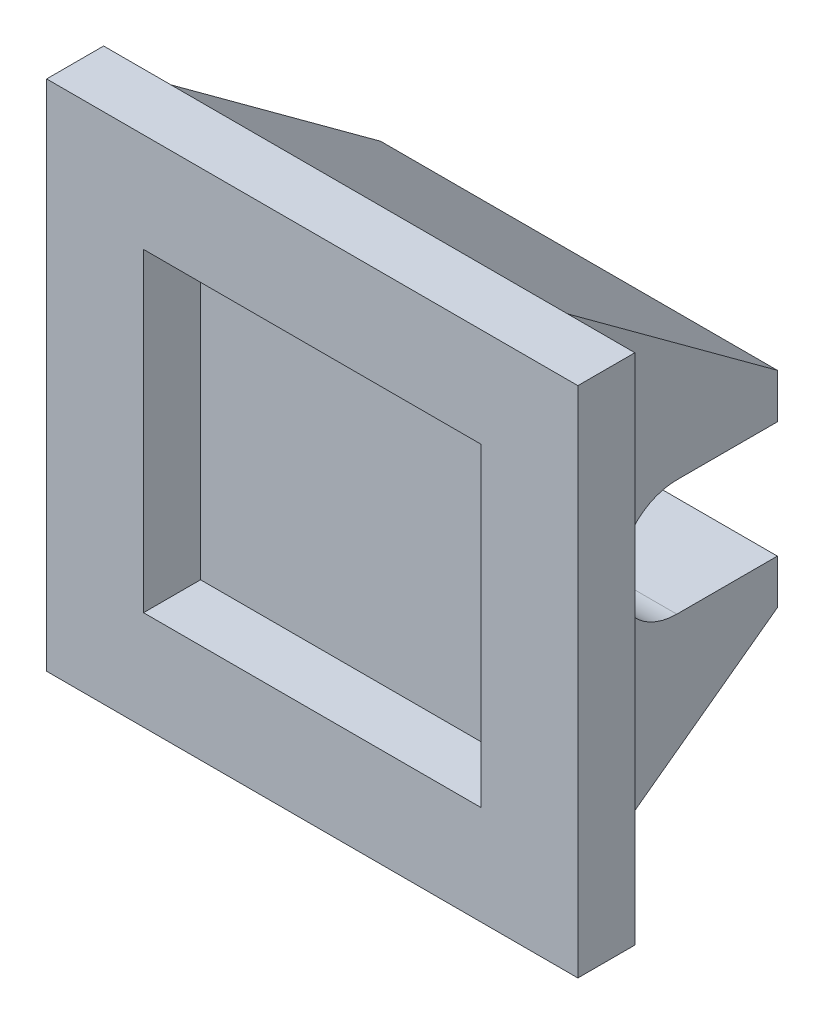
ISO-10303-21;
HEADER;
FILE_DESCRIPTION(('STEP AP214'),'2;1');
FILE_NAME('part.step','',(''),(''),'','','');
FILE_SCHEMA(('AUTOMOTIVE_DESIGN { 1 0 10303 214 1 1 1 1 }'));
ENDSEC;
DATA;
#1=APPLICATION_CONTEXT('core data for automotive mechanical design processes');
#2=APPLICATION_PROTOCOL_DEFINITION('international standard','automotive_design',2000,#1);
#3=PRODUCT_CONTEXT('',#1,'mechanical');
#4=PRODUCT('Part','Part','',(#3));
#5=PRODUCT_RELATED_PRODUCT_CATEGORY('part','',(#4));
#6=PRODUCT_DEFINITION_FORMATION('','',#4);
#7=PRODUCT_DEFINITION_CONTEXT('part definition',#1,'design');
#8=PRODUCT_DEFINITION('design','',#6,#7);
#9=PRODUCT_DEFINITION_SHAPE('','',#8);
#10=(LENGTH_UNIT() NAMED_UNIT(*) SI_UNIT(.MILLI.,.METRE.));
#11=(NAMED_UNIT(*) PLANE_ANGLE_UNIT() SI_UNIT($,.RADIAN.));
#12=(NAMED_UNIT(*) SI_UNIT($,.STERADIAN.) SOLID_ANGLE_UNIT());
#13=UNCERTAINTY_MEASURE_WITH_UNIT(LENGTH_MEASURE(1.E-05),#10,'distance_accuracy_value','');
#14=(GEOMETRIC_REPRESENTATION_CONTEXT(3) GLOBAL_UNCERTAINTY_ASSIGNED_CONTEXT((#13)) GLOBAL_UNIT_ASSIGNED_CONTEXT((#10,
#11,#12)) REPRESENTATION_CONTEXT('',''));
#15=CARTESIAN_POINT('',(0.,0.,0.));
#16=DIRECTION('',(0.,0.,1.));
#17=DIRECTION('',(1.,0.,0.));
#18=AXIS2_PLACEMENT_3D('',#15,#16,#17);
#19=CARTESIAN_POINT('',(0.,0.,0.));
#20=DIRECTION('',(0.,0.,-1.));
#21=DIRECTION('',(-1.,0.,0.));
#22=AXIS2_PLACEMENT_3D('',#19,#20,#21);
#23=PLANE('',#22);
#24=DIRECTION('',(-1.,0.,0.));
#25=VECTOR('',#24,1.);
#26=CARTESIAN_POINT('',(-14.7955,14.2875,0.));
#27=LINE('',#26,#25);
#28=CARTESIAN_POINT('',(-11.049,14.2875,0.));
#29=VERTEX_POINT('',#28);
#30=CARTESIAN_POINT('',(-14.7955,14.2875,0.));
#31=VERTEX_POINT('',#30);
#32=EDGE_CURVE('E56',#29,#31,#27,.T.);
#33=ORIENTED_EDGE('',*,*,#32,.F.);
#34=DIRECTION('',(0.,-1.,0.));
#35=VECTOR('',#34,1.);
#36=CARTESIAN_POINT('',(-11.049,-14.2875,0.));
#37=LINE('',#36,#35);
#38=CARTESIAN_POINT('',(-11.049,-14.2875,0.));
#39=VERTEX_POINT('',#38);
#40=EDGE_CURVE('E181',#29,#39,#37,.T.);
#41=ORIENTED_EDGE('',*,*,#40,.T.);
#42=DIRECTION('',(1.,0.,0.));
#43=VECTOR('',#42,1.);
#44=CARTESIAN_POINT('',(-14.7955,-14.2875,0.));
#45=LINE('',#44,#43);
#46=CARTESIAN_POINT('',(-14.7955,-14.2875,0.));
#47=VERTEX_POINT('',#46);
#48=EDGE_CURVE('E247',#47,#39,#45,.T.);
#49=ORIENTED_EDGE('',*,*,#48,.F.);
#50=DIRECTION('',(0.,-1.,0.));
#51=VECTOR('',#50,1.);
#52=CARTESIAN_POINT('',(-14.7955,-14.2875,0.));
#53=LINE('',#52,#51);
#54=EDGE_CURVE('E259',#31,#47,#53,.T.);
#55=ORIENTED_EDGE('',*,*,#54,.F.);
#56=EDGE_LOOP('',(#33,#41,#49,#55));
#57=FACE_BOUND('',#56,.T.);
#58=ADVANCED_FACE('F33',(#57),#23,.T.);
#59=CARTESIAN_POINT('',(14.7955,-14.2875,3.175));
#60=DIRECTION('',(-1.,0.,0.));
#61=DIRECTION('',(0.,0.,1.));
#62=AXIS2_PLACEMENT_3D('',#59,#60,#61);
#63=PLANE('',#62);
#64=DIRECTION('',(0.,1.,0.));
#65=VECTOR('',#64,1.);
#66=CARTESIAN_POINT('',(14.7955,-14.2875,0.));
#67=LINE('',#66,#65);
#68=CARTESIAN_POINT('',(14.7955,-14.2875,0.));
#69=VERTEX_POINT('',#68);
#70=CARTESIAN_POINT('',(14.7955,14.2875,0.));
#71=VERTEX_POINT('',#70);
#72=EDGE_CURVE('E242',#69,#71,#67,.T.);
#73=ORIENTED_EDGE('',*,*,#72,.T.);
#74=DIRECTION('',(0.,0.,-1.));
#75=VECTOR('',#74,1.);
#76=CARTESIAN_POINT('',(14.7955,14.2875,3.175));
#77=LINE('',#76,#75);
#78=CARTESIAN_POINT('',(14.7955,14.2875,3.175));
#79=VERTEX_POINT('',#78);
#80=EDGE_CURVE('E11',#79,#71,#77,.T.);
#81=ORIENTED_EDGE('',*,*,#80,.F.);
#82=DIRECTION('',(0.,1.,0.));
#83=VECTOR('',#82,1.);
#84=CARTESIAN_POINT('',(14.7955,-14.2875,3.175));
#85=LINE('',#84,#83);
#86=CARTESIAN_POINT('',(14.7955,-14.2875,3.175));
#87=VERTEX_POINT('',#86);
#88=EDGE_CURVE('E243',#87,#79,#85,.T.);
#89=ORIENTED_EDGE('',*,*,#88,.F.);
#90=DIRECTION('',(0.,0.,-1.));
#91=VECTOR('',#90,1.);
#92=CARTESIAN_POINT('',(14.7955,-14.2875,3.175));
#93=LINE('',#92,#91);
#94=EDGE_CURVE('E253',#87,#69,#93,.T.);
#95=ORIENTED_EDGE('',*,*,#94,.T.);
#96=EDGE_LOOP('',(#73,#81,#89,#95));
#97=FACE_BOUND('',#96,.T.);
#98=ADVANCED_FACE('F35',(#97),#63,.F.);
#99=CARTESIAN_POINT('',(-14.7955,14.2875,3.175));
#100=DIRECTION('',(0.,-1.,0.));
#101=DIRECTION('',(0.,0.,-1.));
#102=AXIS2_PLACEMENT_3D('',#99,#100,#101);
#103=PLANE('',#102);
#104=CARTESIAN_POINT('',(11.049,14.2875,0.));
#105=VERTEX_POINT('',#104);
#106=EDGE_CURVE('E256',#71,#105,#27,.T.);
#107=ORIENTED_EDGE('',*,*,#106,.T.);
#108=DIRECTION('',(-1.,0.,0.));
#109=VECTOR('',#108,1.);
#110=CARTESIAN_POINT('',(11.049,14.2875,0.));
#111=LINE('',#110,#109);
#112=EDGE_CURVE('E204',#105,#29,#111,.T.);
#113=ORIENTED_EDGE('',*,*,#112,.T.);
#114=ORIENTED_EDGE('',*,*,#32,.T.);
#115=DIRECTION('',(0.,0.,-1.));
#116=VECTOR('',#115,1.);
#117=CARTESIAN_POINT('',(-14.7955,14.2875,3.175));
#118=LINE('',#117,#116);
#119=CARTESIAN_POINT('',(-14.7955,14.2875,3.175));
#120=VERTEX_POINT('',#119);
#121=EDGE_CURVE('E41',#120,#31,#118,.T.);
#122=ORIENTED_EDGE('',*,*,#121,.F.);
#123=DIRECTION('',(-1.,0.,0.));
#124=VECTOR('',#123,1.);
#125=CARTESIAN_POINT('',(-14.7955,14.2875,3.175));
#126=LINE('',#125,#124);
#127=EDGE_CURVE('E246',#79,#120,#126,.T.);
#128=ORIENTED_EDGE('',*,*,#127,.F.);
#129=ORIENTED_EDGE('',*,*,#80,.T.);
#130=EDGE_LOOP('',(#107,#113,#114,#122,#128,#129));
#131=FACE_BOUND('',#130,.T.);
#132=ADVANCED_FACE('F299',(#131),#103,.F.);
#133=CARTESIAN_POINT('',(-14.7955,-14.2875,3.175));
#134=DIRECTION('',(1.,0.,0.));
#135=DIRECTION('',(0.,0.,-1.));
#136=AXIS2_PLACEMENT_3D('',#133,#134,#135);
#137=PLANE('',#136);
#138=ORIENTED_EDGE('',*,*,#54,.T.);
#139=DIRECTION('',(0.,0.,-1.));
#140=VECTOR('',#139,1.);
#141=CARTESIAN_POINT('',(-14.7955,-14.2875,3.175));
#142=LINE('',#141,#140);
#143=CARTESIAN_POINT('',(-14.7955,-14.2875,3.175));
#144=VERTEX_POINT('',#143);
#145=EDGE_CURVE('E266',#144,#47,#142,.T.);
#146=ORIENTED_EDGE('',*,*,#145,.F.);
#147=DIRECTION('',(0.,-1.,0.));
#148=VECTOR('',#147,1.);
#149=CARTESIAN_POINT('',(-14.7955,-14.2875,3.175));
#150=LINE('',#149,#148);
#151=EDGE_CURVE('E249',#120,#144,#150,.T.);
#152=ORIENTED_EDGE('',*,*,#151,.F.);
#153=ORIENTED_EDGE('',*,*,#121,.T.);
#154=EDGE_LOOP('',(#138,#146,#152,#153));
#155=FACE_BOUND('',#154,.T.);
#156=ADVANCED_FACE('F272',(#155),#137,.F.);
#157=CARTESIAN_POINT('',(-14.7955,-14.2875,3.175));
#158=DIRECTION('',(0.,1.,0.));
#159=DIRECTION('',(0.,0.,1.));
#160=AXIS2_PLACEMENT_3D('',#157,#158,#159);
#161=PLANE('',#160);
#162=ORIENTED_EDGE('',*,*,#48,.T.);
#163=DIRECTION('',(-1.,0.,0.));
#164=VECTOR('',#163,1.);
#165=CARTESIAN_POINT('',(11.049,-14.2875,0.));
#166=LINE('',#165,#164);
#167=CARTESIAN_POINT('',(11.049,-14.2875,0.));
#168=VERTEX_POINT('',#167);
#169=EDGE_CURVE('E239',#168,#39,#166,.T.);
#170=ORIENTED_EDGE('',*,*,#169,.F.);
#171=EDGE_CURVE('E261',#168,#69,#45,.T.);
#172=ORIENTED_EDGE('',*,*,#171,.T.);
#173=ORIENTED_EDGE('',*,*,#94,.F.);
#174=DIRECTION('',(1.,0.,0.));
#175=VECTOR('',#174,1.);
#176=CARTESIAN_POINT('',(-14.7955,-14.2875,3.175));
#177=LINE('',#176,#175);
#178=EDGE_CURVE('E251',#144,#87,#177,.T.);
#179=ORIENTED_EDGE('',*,*,#178,.F.);
#180=ORIENTED_EDGE('',*,*,#145,.T.);
#181=EDGE_LOOP('',(#162,#170,#172,#173,#179,#180));
#182=FACE_BOUND('',#181,.T.);
#183=ADVANCED_FACE('F279',(#182),#161,.F.);
#184=CARTESIAN_POINT('',(0.,0.,3.175));
#185=DIRECTION('',(0.,0.,-1.));
#186=DIRECTION('',(-1.,0.,0.));
#187=AXIS2_PLACEMENT_3D('',#184,#185,#186);
#188=PLANE('',#187);
#189=DIRECTION('',(-1.,0.,0.));
#190=VECTOR('',#189,1.);
#191=CARTESIAN_POINT('',(-9.398,8.763,3.175));
#192=LINE('',#191,#190);
#193=CARTESIAN_POINT('',(9.398,8.763,3.175));
#194=VERTEX_POINT('',#193);
#195=CARTESIAN_POINT('',(-9.398,8.763,3.175));
#196=VERTEX_POINT('',#195);
#197=EDGE_CURVE('E175',#194,#196,#192,.T.);
#198=ORIENTED_EDGE('',*,*,#197,.F.);
#199=DIRECTION('',(0.,1.,0.));
#200=VECTOR('',#199,1.);
#201=CARTESIAN_POINT('',(9.398,8.763,3.175));
#202=LINE('',#201,#200);
#203=CARTESIAN_POINT('',(9.398,-8.763,3.175));
#204=VERTEX_POINT('',#203);
#205=EDGE_CURVE('E48',#204,#194,#202,.T.);
#206=ORIENTED_EDGE('',*,*,#205,.F.);
#207=DIRECTION('',(1.,0.,0.));
#208=VECTOR('',#207,1.);
#209=CARTESIAN_POINT('',(-9.398,-8.763,3.175));
#210=LINE('',#209,#208);
#211=CARTESIAN_POINT('',(-9.398,-8.763,3.175));
#212=VERTEX_POINT('',#211);
#213=EDGE_CURVE('E166',#212,#204,#210,.T.);
#214=ORIENTED_EDGE('',*,*,#213,.F.);
#215=DIRECTION('',(0.,-1.,0.));
#216=VECTOR('',#215,1.);
#217=CARTESIAN_POINT('',(-9.398,8.763,3.175));
#218=LINE('',#217,#216);
#219=EDGE_CURVE('E169',#196,#212,#218,.T.);
#220=ORIENTED_EDGE('',*,*,#219,.F.);
#221=EDGE_LOOP('',(#198,#206,#214,#220));
#222=FACE_BOUND('',#221,.T.);
#223=ORIENTED_EDGE('',*,*,#88,.T.);
#224=ORIENTED_EDGE('',*,*,#127,.T.);
#225=ORIENTED_EDGE('',*,*,#151,.T.);
#226=ORIENTED_EDGE('',*,*,#178,.T.);
#227=EDGE_LOOP('',(#223,#224,#225,#226));
#228=FACE_BOUND('',#227,.T.);
#229=ADVANCED_FACE('F305',(#222,#228),#188,.F.);
#230=DIRECTION('',(0.,-1.,0.));
#231=VECTOR('',#230,1.);
#232=CARTESIAN_POINT('',(11.049,-14.2875,0.));
#233=LINE('',#232,#231);
#234=EDGE_CURVE('E185',#105,#168,#233,.T.);
#235=ORIENTED_EDGE('',*,*,#234,.F.);
#236=ORIENTED_EDGE('',*,*,#106,.F.);
#237=ORIENTED_EDGE('',*,*,#72,.F.);
#238=ORIENTED_EDGE('',*,*,#171,.F.);
#239=EDGE_LOOP('',(#235,#236,#237,#238));
#240=FACE_BOUND('',#239,.T.);
#241=ADVANCED_FACE('F297',(#240),#23,.T.);
#242=CARTESIAN_POINT('',(11.049,-14.2875,0.));
#243=DIRECTION('',(0.,0.806580864825992,0.591123767494215));
#244=DIRECTION('',(0.,-0.591123767494215,0.806580864825992));
#245=AXIS2_PLACEMENT_3D('',#242,#243,#244);
#246=PLANE('',#245);
#247=DIRECTION('',(0.,0.591123767494215,-0.806580864825992));
#248=VECTOR('',#247,1.);
#249=CARTESIAN_POINT('',(-11.049,-14.2875,0.));
#250=LINE('',#249,#248);
#251=CARTESIAN_POINT('',(-11.049,-5.724576676878,-11.684));
#252=VERTEX_POINT('',#251);
#253=EDGE_CURVE('E206',#39,#252,#250,.T.);
#254=ORIENTED_EDGE('',*,*,#253,.T.);
#255=DIRECTION('',(-1.,0.,0.));
#256=VECTOR('',#255,1.);
#257=CARTESIAN_POINT('',(11.049,-5.724576676878,-11.684));
#258=LINE('',#257,#256);
#259=CARTESIAN_POINT('',(11.049,-5.724576676878,-11.684));
#260=VERTEX_POINT('',#259);
#261=EDGE_CURVE('E236',#260,#252,#258,.T.);
#262=ORIENTED_EDGE('',*,*,#261,.F.);
#263=DIRECTION('',(0.,0.591123767494215,-0.806580864825992));
#264=VECTOR('',#263,1.);
#265=CARTESIAN_POINT('',(11.049,-14.2875,0.));
#266=LINE('',#265,#264);
#267=EDGE_CURVE('E188',#168,#260,#266,.T.);
#268=ORIENTED_EDGE('',*,*,#267,.F.);
#269=ORIENTED_EDGE('',*,*,#169,.T.);
#270=EDGE_LOOP('',(#254,#262,#268,#269));
#271=FACE_BOUND('',#270,.T.);
#272=ADVANCED_FACE('F290',(#271),#246,.F.);
#273=CARTESIAN_POINT('',(11.049,-5.724576676878,-11.684));
#274=DIRECTION('',(0.,0.,1.));
#275=DIRECTION('',(1.,0.,0.));
#276=AXIS2_PLACEMENT_3D('',#273,#274,#275);
#277=PLANE('',#276);
#278=DIRECTION('',(0.,1.,0.));
#279=VECTOR('',#278,1.);
#280=CARTESIAN_POINT('',(-11.049,-5.724576676878,-11.684));
#281=LINE('',#280,#279);
#282=CARTESIAN_POINT('',(-11.049,-3.2385,-11.684));
#283=VERTEX_POINT('',#282);
#284=EDGE_CURVE('E208',#252,#283,#281,.T.);
#285=ORIENTED_EDGE('',*,*,#284,.T.);
#286=DIRECTION('',(-1.,0.,0.));
#287=VECTOR('',#286,1.);
#288=CARTESIAN_POINT('',(11.049,-3.2385,-11.684));
#289=LINE('',#288,#287);
#290=CARTESIAN_POINT('',(11.049,-3.2385,-11.684));
#291=VERTEX_POINT('',#290);
#292=EDGE_CURVE('E233',#291,#283,#289,.T.);
#293=ORIENTED_EDGE('',*,*,#292,.F.);
#294=DIRECTION('',(0.,1.,0.));
#295=VECTOR('',#294,1.);
#296=CARTESIAN_POINT('',(11.049,-5.724576676878,-11.684));
#297=LINE('',#296,#295);
#298=EDGE_CURVE('E191',#260,#291,#297,.T.);
#299=ORIENTED_EDGE('',*,*,#298,.F.);
#300=ORIENTED_EDGE('',*,*,#261,.T.);
#301=EDGE_LOOP('',(#285,#293,#299,#300));
#302=FACE_BOUND('',#301,.T.);
#303=ADVANCED_FACE('F352',(#302),#277,.F.);
#304=CARTESIAN_POINT('',(11.049,-3.2385,-11.684));
#305=DIRECTION('',(0.,-1.,0.));
#306=DIRECTION('',(0.,0.,-1.));
#307=AXIS2_PLACEMENT_3D('',#304,#305,#306);
#308=PLANE('',#307);
#309=DIRECTION('',(0.,0.,1.));
#310=VECTOR('',#309,1.);
#311=CARTESIAN_POINT('',(-11.049,-3.2385,-11.684));
#312=LINE('',#311,#310);
#313=CARTESIAN_POINT('',(-11.049,-3.2385,-6.0833));
#314=VERTEX_POINT('',#313);
#315=EDGE_CURVE('E210',#283,#314,#312,.T.);
#316=ORIENTED_EDGE('',*,*,#315,.T.);
#317=DIRECTION('',(-1.,0.,0.));
#318=VECTOR('',#317,1.);
#319=CARTESIAN_POINT('',(11.049,-3.2385,-6.0833));
#320=LINE('',#319,#318);
#321=CARTESIAN_POINT('',(11.049,-3.2385,-6.0833));
#322=VERTEX_POINT('',#321);
#323=EDGE_CURVE('E230',#322,#314,#320,.T.);
#324=ORIENTED_EDGE('',*,*,#323,.F.);
#325=DIRECTION('',(0.,0.,1.));
#326=VECTOR('',#325,1.);
#327=CARTESIAN_POINT('',(11.049,-3.2385,-11.684));
#328=LINE('',#327,#326);
#329=EDGE_CURVE('E193',#291,#322,#328,.T.);
#330=ORIENTED_EDGE('',*,*,#329,.F.);
#331=ORIENTED_EDGE('',*,*,#292,.T.);
#332=EDGE_LOOP('',(#316,#324,#330,#331));
#333=FACE_BOUND('',#332,.T.);
#334=ADVANCED_FACE('F360',(#333),#308,.F.);
#335=CARTESIAN_POINT('',(11.049,0.,-6.0833));
#336=DIRECTION('',(-1.,0.,0.));
#337=DIRECTION('',(0.,0.,1.));
#338=AXIS2_PLACEMENT_3D('',#335,#336,#337);
#339=CYLINDRICAL_SURFACE('',#338,3.2385);
#340=CARTESIAN_POINT('',(-11.049,0.,-6.0833));
#341=DIRECTION('',(-1.,0.,0.));
#342=DIRECTION('',(0.,0.,1.));
#343=AXIS2_PLACEMENT_3D('',#340,#341,#342);
#344=CIRCLE('',#343,3.2385);
#345=CARTESIAN_POINT('',(-11.049,3.2385,-6.0833));
#346=VERTEX_POINT('',#345);
#347=EDGE_CURVE('E212',#314,#346,#344,.T.);
#348=ORIENTED_EDGE('',*,*,#347,.T.);
#349=DIRECTION('',(-1.,0.,0.));
#350=VECTOR('',#349,1.);
#351=CARTESIAN_POINT('',(11.049,3.2385,-6.0833));
#352=LINE('',#351,#350);
#353=CARTESIAN_POINT('',(11.049,3.2385,-6.0833));
#354=VERTEX_POINT('',#353);
#355=EDGE_CURVE('E227',#354,#346,#352,.T.);
#356=ORIENTED_EDGE('',*,*,#355,.F.);
#357=CARTESIAN_POINT('',(11.049,0.,-6.0833));
#358=DIRECTION('',(-1.,0.,0.));
#359=DIRECTION('',(0.,0.,1.));
#360=AXIS2_PLACEMENT_3D('',#357,#358,#359);
#361=CIRCLE('',#360,3.2385);
#362=EDGE_CURVE('E195',#322,#354,#361,.T.);
#363=ORIENTED_EDGE('',*,*,#362,.F.);
#364=ORIENTED_EDGE('',*,*,#323,.T.);
#365=EDGE_LOOP('',(#348,#356,#363,#364));
#366=FACE_BOUND('',#365,.T.);
#367=ADVANCED_FACE('F370',(#366),#339,.F.);
#368=CARTESIAN_POINT('',(11.049,3.2385,-11.684));
#369=DIRECTION('',(0.,1.,0.));
#370=DIRECTION('',(0.,0.,1.));
#371=AXIS2_PLACEMENT_3D('',#368,#369,#370);
#372=PLANE('',#371);
#373=DIRECTION('',(0.,0.,-1.));
#374=VECTOR('',#373,1.);
#375=CARTESIAN_POINT('',(-11.049,3.2385,-11.684));
#376=LINE('',#375,#374);
#377=CARTESIAN_POINT('',(-11.049,3.2385,-11.684));
#378=VERTEX_POINT('',#377);
#379=EDGE_CURVE('E214',#346,#378,#376,.T.);
#380=ORIENTED_EDGE('',*,*,#379,.T.);
#381=DIRECTION('',(-1.,0.,0.));
#382=VECTOR('',#381,1.);
#383=CARTESIAN_POINT('',(11.049,3.2385,-11.684));
#384=LINE('',#383,#382);
#385=CARTESIAN_POINT('',(11.049,3.2385,-11.684));
#386=VERTEX_POINT('',#385);
#387=EDGE_CURVE('E224',#386,#378,#384,.T.);
#388=ORIENTED_EDGE('',*,*,#387,.F.);
#389=DIRECTION('',(0.,0.,-1.));
#390=VECTOR('',#389,1.);
#391=CARTESIAN_POINT('',(11.049,3.2385,-11.684));
#392=LINE('',#391,#390);
#393=EDGE_CURVE('E197',#354,#386,#392,.T.);
#394=ORIENTED_EDGE('',*,*,#393,.F.);
#395=ORIENTED_EDGE('',*,*,#355,.T.);
#396=EDGE_LOOP('',(#380,#388,#394,#395));
#397=FACE_BOUND('',#396,.T.);
#398=ADVANCED_FACE('F380',(#397),#372,.F.);
#399=CARTESIAN_POINT('',(11.049,5.724576676878,-11.684));
#400=DIRECTION('',(0.,0.,1.));
#401=DIRECTION('',(1.,0.,0.));
#402=AXIS2_PLACEMENT_3D('',#399,#400,#401);
#403=PLANE('',#402);
#404=DIRECTION('',(0.,1.,0.));
#405=VECTOR('',#404,1.);
#406=CARTESIAN_POINT('',(-11.049,5.724576676878,-11.684));
#407=LINE('',#406,#405);
#408=CARTESIAN_POINT('',(-11.049,5.724576676878,-11.684));
#409=VERTEX_POINT('',#408);
#410=EDGE_CURVE('E216',#378,#409,#407,.T.);
#411=ORIENTED_EDGE('',*,*,#410,.T.);
#412=DIRECTION('',(-1.,0.,0.));
#413=VECTOR('',#412,1.);
#414=CARTESIAN_POINT('',(11.049,5.724576676878,-11.684));
#415=LINE('',#414,#413);
#416=CARTESIAN_POINT('',(11.049,5.724576676878,-11.684));
#417=VERTEX_POINT('',#416);
#418=EDGE_CURVE('E221',#417,#409,#415,.T.);
#419=ORIENTED_EDGE('',*,*,#418,.F.);
#420=DIRECTION('',(0.,1.,0.));
#421=VECTOR('',#420,1.);
#422=CARTESIAN_POINT('',(11.049,5.724576676878,-11.684));
#423=LINE('',#422,#421);
#424=EDGE_CURVE('E199',#386,#417,#423,.T.);
#425=ORIENTED_EDGE('',*,*,#424,.F.);
#426=ORIENTED_EDGE('',*,*,#387,.T.);
#427=EDGE_LOOP('',(#411,#419,#425,#426));
#428=FACE_BOUND('',#427,.T.);
#429=ADVANCED_FACE('F390',(#428),#403,.F.);
#430=CARTESIAN_POINT('',(11.049,14.2875,0.));
#431=DIRECTION('',(0.,-0.806580864825992,0.591123767494215));
#432=DIRECTION('',(0.,-0.591123767494215,-0.806580864825992));
#433=AXIS2_PLACEMENT_3D('',#430,#431,#432);
#434=PLANE('',#433);
#435=DIRECTION('',(0.,0.591123767494215,0.806580864825992));
#436=VECTOR('',#435,1.);
#437=CARTESIAN_POINT('',(-11.049,14.2875,0.));
#438=LINE('',#437,#436);
#439=EDGE_CURVE('E189',#409,#29,#438,.T.);
#440=ORIENTED_EDGE('',*,*,#439,.T.);
#441=ORIENTED_EDGE('',*,*,#112,.F.);
#442=DIRECTION('',(0.,0.591123767494215,0.806580864825992));
#443=VECTOR('',#442,1.);
#444=CARTESIAN_POINT('',(11.049,14.2875,0.));
#445=LINE('',#444,#443);
#446=EDGE_CURVE('E201',#417,#105,#445,.T.);
#447=ORIENTED_EDGE('',*,*,#446,.F.);
#448=ORIENTED_EDGE('',*,*,#418,.T.);
#449=EDGE_LOOP('',(#440,#441,#447,#448));
#450=FACE_BOUND('',#449,.T.);
#451=ADVANCED_FACE('F400',(#450),#434,.F.);
#452=CARTESIAN_POINT('',(11.049,0.,-6.0833));
#453=DIRECTION('',(-1.,0.,0.));
#454=DIRECTION('',(0.,0.,1.));
#455=AXIS2_PLACEMENT_3D('',#452,#453,#454);
#456=PLANE('',#455);
#457=ORIENTED_EDGE('',*,*,#234,.T.);
#458=ORIENTED_EDGE('',*,*,#267,.T.);
#459=ORIENTED_EDGE('',*,*,#298,.T.);
#460=ORIENTED_EDGE('',*,*,#329,.T.);
#461=ORIENTED_EDGE('',*,*,#362,.T.);
#462=ORIENTED_EDGE('',*,*,#393,.T.);
#463=ORIENTED_EDGE('',*,*,#424,.T.);
#464=ORIENTED_EDGE('',*,*,#446,.T.);
#465=EDGE_LOOP('',(#457,#458,#459,#460,#461,#462,#463,#464));
#466=FACE_BOUND('',#465,.T.);
#467=ADVANCED_FACE('F293',(#466),#456,.F.);
#468=CARTESIAN_POINT('',(-11.049,0.,-6.0833));
#469=DIRECTION('',(-1.,0.,0.));
#470=DIRECTION('',(0.,0.,1.));
#471=AXIS2_PLACEMENT_3D('',#468,#469,#470);
#472=PLANE('',#471);
#473=ORIENTED_EDGE('',*,*,#40,.F.);
#474=ORIENTED_EDGE('',*,*,#439,.F.);
#475=ORIENTED_EDGE('',*,*,#410,.F.);
#476=ORIENTED_EDGE('',*,*,#379,.F.);
#477=ORIENTED_EDGE('',*,*,#347,.F.);
#478=ORIENTED_EDGE('',*,*,#315,.F.);
#479=ORIENTED_EDGE('',*,*,#284,.F.);
#480=ORIENTED_EDGE('',*,*,#253,.F.);
#481=EDGE_LOOP('',(#473,#474,#475,#476,#477,#478,#479,#480));
#482=FACE_BOUND('',#481,.T.);
#483=ADVANCED_FACE('F284',(#482),#472,.T.);
#484=CARTESIAN_POINT('',(9.398,8.763,0.));
#485=DIRECTION('',(1.,0.,0.));
#486=DIRECTION('',(0.,1.,0.));
#487=AXIS2_PLACEMENT_3D('',#484,#485,#486);
#488=PLANE('',#487);
#489=ORIENTED_EDGE('',*,*,#205,.T.);
#490=DIRECTION('',(0.,0.,1.));
#491=VECTOR('',#490,1.);
#492=CARTESIAN_POINT('',(9.398,8.763,0.));
#493=LINE('',#492,#491);
#494=CARTESIAN_POINT('',(9.398,8.763,0.));
#495=VERTEX_POINT('',#494);
#496=EDGE_CURVE('E144',#495,#194,#493,.T.);
#497=ORIENTED_EDGE('',*,*,#496,.F.);
#498=DIRECTION('',(0.,1.,0.));
#499=VECTOR('',#498,1.);
#500=CARTESIAN_POINT('',(9.398,8.763,0.));
#501=LINE('',#500,#499);
#502=CARTESIAN_POINT('',(9.398,-8.763,0.));
#503=VERTEX_POINT('',#502);
#504=EDGE_CURVE('E148',#503,#495,#501,.T.);
#505=ORIENTED_EDGE('',*,*,#504,.F.);
#506=DIRECTION('',(0.,0.,1.));
#507=VECTOR('',#506,1.);
#508=CARTESIAN_POINT('',(9.398,-8.763,0.));
#509=LINE('',#508,#507);
#510=EDGE_CURVE('E179',#503,#204,#509,.T.);
#511=ORIENTED_EDGE('',*,*,#510,.T.);
#512=EDGE_LOOP('',(#489,#497,#505,#511));
#513=FACE_BOUND('',#512,.T.);
#514=ADVANCED_FACE('F146',(#513),#488,.F.);
#515=CARTESIAN_POINT('',(-9.398,-8.763,0.));
#516=DIRECTION('',(0.,-1.,0.));
#517=DIRECTION('',(0.,0.,-1.));
#518=AXIS2_PLACEMENT_3D('',#515,#516,#517);
#519=PLANE('',#518);
#520=ORIENTED_EDGE('',*,*,#213,.T.);
#521=ORIENTED_EDGE('',*,*,#510,.F.);
#522=DIRECTION('',(1.,0.,0.));
#523=VECTOR('',#522,1.);
#524=CARTESIAN_POINT('',(-9.398,-8.763,0.));
#525=LINE('',#524,#523);
#526=CARTESIAN_POINT('',(-9.398,-8.763,0.));
#527=VERTEX_POINT('',#526);
#528=EDGE_CURVE('E154',#527,#503,#525,.T.);
#529=ORIENTED_EDGE('',*,*,#528,.F.);
#530=DIRECTION('',(0.,0.,1.));
#531=VECTOR('',#530,1.);
#532=CARTESIAN_POINT('',(-9.398,-8.763,0.));
#533=LINE('',#532,#531);
#534=EDGE_CURVE('E182',#527,#212,#533,.T.);
#535=ORIENTED_EDGE('',*,*,#534,.T.);
#536=EDGE_LOOP('',(#520,#521,#529,#535));
#537=FACE_BOUND('',#536,.T.);
#538=ADVANCED_FACE('F438',(#537),#519,.F.);
#539=CARTESIAN_POINT('',(-9.398,8.763,0.));
#540=DIRECTION('',(-1.,0.,0.));
#541=DIRECTION('',(0.,-1.,0.));
#542=AXIS2_PLACEMENT_3D('',#539,#540,#541);
#543=PLANE('',#542);
#544=ORIENTED_EDGE('',*,*,#219,.T.);
#545=ORIENTED_EDGE('',*,*,#534,.F.);
#546=DIRECTION('',(0.,-1.,0.));
#547=VECTOR('',#546,1.);
#548=CARTESIAN_POINT('',(-9.398,8.763,0.));
#549=LINE('',#548,#547);
#550=CARTESIAN_POINT('',(-9.398,8.763,0.));
#551=VERTEX_POINT('',#550);
#552=EDGE_CURVE('E162',#551,#527,#549,.T.);
#553=ORIENTED_EDGE('',*,*,#552,.F.);
#554=DIRECTION('',(0.,0.,1.));
#555=VECTOR('',#554,1.);
#556=CARTESIAN_POINT('',(-9.398,8.763,0.));
#557=LINE('',#556,#555);
#558=EDGE_CURVE('E153',#551,#196,#557,.T.);
#559=ORIENTED_EDGE('',*,*,#558,.T.);
#560=EDGE_LOOP('',(#544,#545,#553,#559));
#561=FACE_BOUND('',#560,.T.);
#562=ADVANCED_FACE('F447',(#561),#543,.F.);
#563=CARTESIAN_POINT('',(-9.398,8.763,0.));
#564=DIRECTION('',(0.,1.,0.));
#565=DIRECTION('',(-1.,0.,0.));
#566=AXIS2_PLACEMENT_3D('',#563,#564,#565);
#567=PLANE('',#566);
#568=ORIENTED_EDGE('',*,*,#197,.T.);
#569=ORIENTED_EDGE('',*,*,#558,.F.);
#570=DIRECTION('',(-1.,0.,0.));
#571=VECTOR('',#570,1.);
#572=CARTESIAN_POINT('',(-9.398,8.763,0.));
#573=LINE('',#572,#571);
#574=EDGE_CURVE('E157',#495,#551,#573,.T.);
#575=ORIENTED_EDGE('',*,*,#574,.F.);
#576=ORIENTED_EDGE('',*,*,#496,.T.);
#577=EDGE_LOOP('',(#568,#569,#575,#576));
#578=FACE_BOUND('',#577,.T.);
#579=ADVANCED_FACE('F158',(#578),#567,.F.);
#580=CARTESIAN_POINT('',(0.,0.,0.));
#581=DIRECTION('',(0.,0.,1.));
#582=DIRECTION('',(1.,0.,0.));
#583=AXIS2_PLACEMENT_3D('',#580,#581,#582);
#584=PLANE('',#583);
#585=ORIENTED_EDGE('',*,*,#504,.T.);
#586=ORIENTED_EDGE('',*,*,#574,.T.);
#587=ORIENTED_EDGE('',*,*,#552,.T.);
#588=ORIENTED_EDGE('',*,*,#528,.T.);
#589=EDGE_LOOP('',(#585,#586,#587,#588));
#590=FACE_BOUND('',#589,.T.);
#591=ADVANCED_FACE('F164',(#590),#584,.T.);
#592=CLOSED_SHELL('',(#58,#98,#132,#156,#183,#229,#241,#272,#303,#334,#367,#398,#429,#451,#467,
#483,#514,#538,#562,#579,#591));
#593=MANIFOLD_SOLID_BREP('B2',#592);
#594=ADVANCED_BREP_SHAPE_REPRESENTATION('',(#18,#593),#14);
#595=SHAPE_DEFINITION_REPRESENTATION(#9,#594);
ENDSEC;
END-ISO-10303-21;
